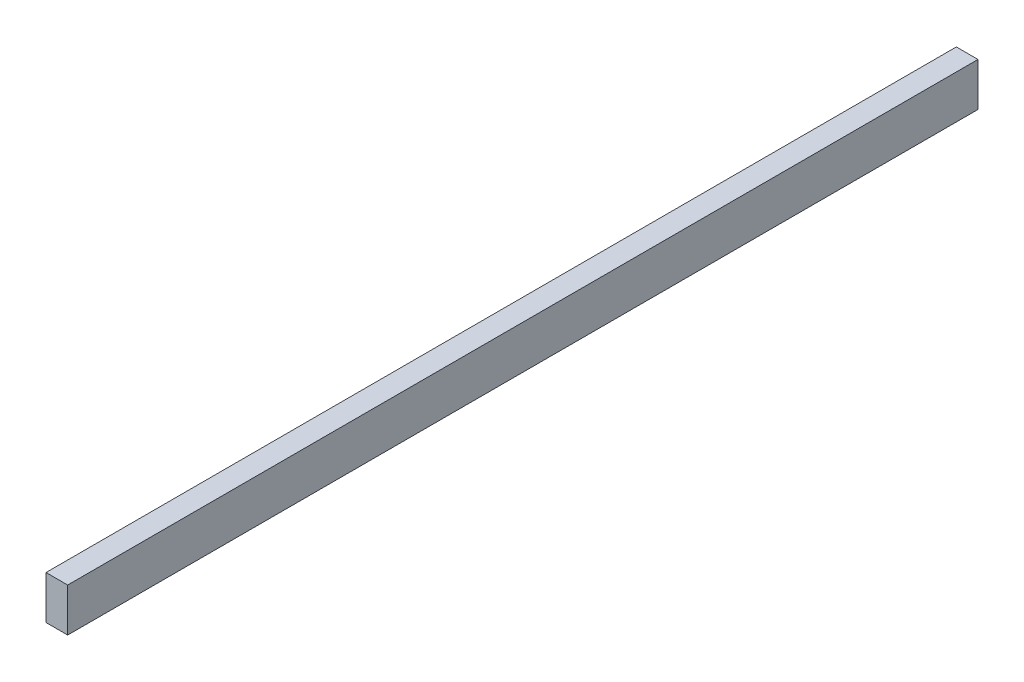
ISO-10303-21;
HEADER;
FILE_DESCRIPTION(('STEP AP214'),'2;1');
FILE_NAME('part.step','',(''),(''),'','','');
FILE_SCHEMA(('AUTOMOTIVE_DESIGN { 1 0 10303 214 1 1 1 1 }'));
ENDSEC;
DATA;
#1=APPLICATION_CONTEXT('core data for automotive mechanical design processes');
#2=APPLICATION_PROTOCOL_DEFINITION('international standard','automotive_design',2000,#1);
#3=PRODUCT_CONTEXT('',#1,'mechanical');
#4=PRODUCT('Part','Part','',(#3));
#5=PRODUCT_RELATED_PRODUCT_CATEGORY('part','',(#4));
#6=PRODUCT_DEFINITION_FORMATION('','',#4);
#7=PRODUCT_DEFINITION_CONTEXT('part definition',#1,'design');
#8=PRODUCT_DEFINITION('design','',#6,#7);
#9=PRODUCT_DEFINITION_SHAPE('','',#8);
#10=(LENGTH_UNIT() NAMED_UNIT(*) SI_UNIT(.MILLI.,.METRE.));
#11=(NAMED_UNIT(*) PLANE_ANGLE_UNIT() SI_UNIT($,.RADIAN.));
#12=(NAMED_UNIT(*) SI_UNIT($,.STERADIAN.) SOLID_ANGLE_UNIT());
#13=UNCERTAINTY_MEASURE_WITH_UNIT(LENGTH_MEASURE(1.E-05),#10,'distance_accuracy_value','');
#14=(GEOMETRIC_REPRESENTATION_CONTEXT(3) GLOBAL_UNCERTAINTY_ASSIGNED_CONTEXT((#13)) GLOBAL_UNIT_ASSIGNED_CONTEXT((#10,
#11,#12)) REPRESENTATION_CONTEXT('',''));
#15=CARTESIAN_POINT('',(0.,0.,0.));
#16=DIRECTION('',(0.,0.,1.));
#17=DIRECTION('',(1.,0.,0.));
#18=AXIS2_PLACEMENT_3D('',#15,#16,#17);
#19=CARTESIAN_POINT('',(-12.7,25.4,1066.8));
#20=DIRECTION('',(1.,0.,0.));
#21=DIRECTION('',(0.,1.,0.));
#22=AXIS2_PLACEMENT_3D('',#19,#20,#21);
#23=PLANE('',#22);
#24=DIRECTION('',(0.,-1.,0.));
#25=VECTOR('',#24,1.);
#26=CARTESIAN_POINT('',(-12.7,25.4,0.));
#27=LINE('',#26,#25);
#28=CARTESIAN_POINT('',(-12.7,25.4,0.));
#29=VERTEX_POINT('',#28);
#30=CARTESIAN_POINT('',(-12.7,-25.4,0.));
#31=VERTEX_POINT('',#30);
#32=EDGE_CURVE('E106',#29,#31,#27,.T.);
#33=ORIENTED_EDGE('',*,*,#32,.T.);
#34=DIRECTION('',(0.,0.,-1.));
#35=VECTOR('',#34,1.);
#36=CARTESIAN_POINT('',(-12.7,-25.4,1066.8));
#37=LINE('',#36,#35);
#38=CARTESIAN_POINT('',(-12.7,-25.4,1066.8));
#39=VERTEX_POINT('',#38);
#40=EDGE_CURVE('E11',#39,#31,#37,.T.);
#41=ORIENTED_EDGE('',*,*,#40,.F.);
#42=DIRECTION('',(0.,-1.,0.));
#43=VECTOR('',#42,1.);
#44=CARTESIAN_POINT('',(-12.7,25.4,1066.8));
#45=LINE('',#44,#43);
#46=CARTESIAN_POINT('',(-12.7,25.4,1066.8));
#47=VERTEX_POINT('',#46);
#48=EDGE_CURVE('E94',#47,#39,#45,.T.);
#49=ORIENTED_EDGE('',*,*,#48,.F.);
#50=DIRECTION('',(0.,0.,-1.));
#51=VECTOR('',#50,1.);
#52=CARTESIAN_POINT('',(-12.7,25.4,1066.8));
#53=LINE('',#52,#51);
#54=EDGE_CURVE('E102',#47,#29,#53,.T.);
#55=ORIENTED_EDGE('',*,*,#54,.T.);
#56=EDGE_LOOP('',(#33,#41,#49,#55));
#57=FACE_BOUND('',#56,.T.);
#58=ADVANCED_FACE('F43',(#57),#23,.F.);
#59=CARTESIAN_POINT('',(-12.7,-25.4,1066.8));
#60=DIRECTION('',(0.,1.,0.));
#61=DIRECTION('',(0.,0.,1.));
#62=AXIS2_PLACEMENT_3D('',#59,#60,#61);
#63=PLANE('',#62);
#64=DIRECTION('',(1.,0.,0.));
#65=VECTOR('',#64,1.);
#66=CARTESIAN_POINT('',(-12.7,-25.4,0.));
#67=LINE('',#66,#65);
#68=CARTESIAN_POINT('',(12.7,-25.4,0.));
#69=VERTEX_POINT('',#68);
#70=EDGE_CURVE('E98',#31,#69,#67,.T.);
#71=ORIENTED_EDGE('',*,*,#70,.T.);
#72=DIRECTION('',(0.,0.,-1.));
#73=VECTOR('',#72,1.);
#74=CARTESIAN_POINT('',(12.7,-25.4,1066.8));
#75=LINE('',#74,#73);
#76=CARTESIAN_POINT('',(12.7,-25.4,1066.8));
#77=VERTEX_POINT('',#76);
#78=EDGE_CURVE('E51',#77,#69,#75,.T.);
#79=ORIENTED_EDGE('',*,*,#78,.F.);
#80=DIRECTION('',(1.,0.,0.));
#81=VECTOR('',#80,1.);
#82=CARTESIAN_POINT('',(-12.7,-25.4,1066.8));
#83=LINE('',#82,#81);
#84=EDGE_CURVE('E89',#39,#77,#83,.T.);
#85=ORIENTED_EDGE('',*,*,#84,.F.);
#86=ORIENTED_EDGE('',*,*,#40,.T.);
#87=EDGE_LOOP('',(#71,#79,#85,#86));
#88=FACE_BOUND('',#87,.T.);
#89=ADVANCED_FACE('F97',(#88),#63,.F.);
#90=CARTESIAN_POINT('',(12.7,25.4,1066.8));
#91=DIRECTION('',(-1.,0.,0.));
#92=DIRECTION('',(0.,-1.,0.));
#93=AXIS2_PLACEMENT_3D('',#90,#91,#92);
#94=PLANE('',#93);
#95=DIRECTION('',(0.,1.,0.));
#96=VECTOR('',#95,1.);
#97=CARTESIAN_POINT('',(12.7,25.4,0.));
#98=LINE('',#97,#96);
#99=CARTESIAN_POINT('',(12.7,25.4,0.));
#100=VERTEX_POINT('',#99);
#101=EDGE_CURVE('E76',#69,#100,#98,.T.);
#102=ORIENTED_EDGE('',*,*,#101,.T.);
#103=DIRECTION('',(0.,0.,-1.));
#104=VECTOR('',#103,1.);
#105=CARTESIAN_POINT('',(12.7,25.4,1066.8));
#106=LINE('',#105,#104);
#107=CARTESIAN_POINT('',(12.7,25.4,1066.8));
#108=VERTEX_POINT('',#107);
#109=EDGE_CURVE('E99',#108,#100,#106,.T.);
#110=ORIENTED_EDGE('',*,*,#109,.F.);
#111=DIRECTION('',(0.,1.,0.));
#112=VECTOR('',#111,1.);
#113=CARTESIAN_POINT('',(12.7,25.4,1066.8));
#114=LINE('',#113,#112);
#115=EDGE_CURVE('E92',#77,#108,#114,.T.);
#116=ORIENTED_EDGE('',*,*,#115,.F.);
#117=ORIENTED_EDGE('',*,*,#78,.T.);
#118=EDGE_LOOP('',(#102,#110,#116,#117));
#119=FACE_BOUND('',#118,.T.);
#120=ADVANCED_FACE('F100',(#119),#94,.F.);
#121=CARTESIAN_POINT('',(-12.7,25.4,1066.8));
#122=DIRECTION('',(0.,-1.,0.));
#123=DIRECTION('',(0.,0.,-1.));
#124=AXIS2_PLACEMENT_3D('',#121,#122,#123);
#125=PLANE('',#124);
#126=DIRECTION('',(-1.,0.,0.));
#127=VECTOR('',#126,1.);
#128=CARTESIAN_POINT('',(-12.7,25.4,0.));
#129=LINE('',#128,#127);
#130=EDGE_CURVE('E82',#100,#29,#129,.T.);
#131=ORIENTED_EDGE('',*,*,#130,.T.);
#132=ORIENTED_EDGE('',*,*,#54,.F.);
#133=DIRECTION('',(-1.,0.,0.));
#134=VECTOR('',#133,1.);
#135=CARTESIAN_POINT('',(-12.7,25.4,1066.8));
#136=LINE('',#135,#134);
#137=EDGE_CURVE('E59',#108,#47,#136,.T.);
#138=ORIENTED_EDGE('',*,*,#137,.F.);
#139=ORIENTED_EDGE('',*,*,#109,.T.);
#140=EDGE_LOOP('',(#131,#132,#138,#139));
#141=FACE_BOUND('',#140,.T.);
#142=ADVANCED_FACE('F113',(#141),#125,.F.);
#143=CARTESIAN_POINT('',(0.,0.,1066.8));
#144=DIRECTION('',(0.,0.,1.));
#145=DIRECTION('',(1.,0.,0.));
#146=AXIS2_PLACEMENT_3D('',#143,#144,#145);
#147=PLANE('',#146);
#148=ORIENTED_EDGE('',*,*,#48,.T.);
#149=ORIENTED_EDGE('',*,*,#84,.T.);
#150=ORIENTED_EDGE('',*,*,#115,.T.);
#151=ORIENTED_EDGE('',*,*,#137,.T.);
#152=EDGE_LOOP('',(#148,#149,#150,#151));
#153=FACE_BOUND('',#152,.T.);
#154=ADVANCED_FACE('F90',(#153),#147,.T.);
#155=CARTESIAN_POINT('',(0.,0.,0.));
#156=DIRECTION('',(0.,0.,1.));
#157=DIRECTION('',(1.,0.,0.));
#158=AXIS2_PLACEMENT_3D('',#155,#156,#157);
#159=PLANE('',#158);
#160=ORIENTED_EDGE('',*,*,#32,.F.);
#161=ORIENTED_EDGE('',*,*,#130,.F.);
#162=ORIENTED_EDGE('',*,*,#101,.F.);
#163=ORIENTED_EDGE('',*,*,#70,.F.);
#164=EDGE_LOOP('',(#160,#161,#162,#163));
#165=FACE_BOUND('',#164,.T.);
#166=ADVANCED_FACE('F116',(#165),#159,.F.);
#167=CLOSED_SHELL('',(#58,#89,#120,#142,#154,#166));
#168=MANIFOLD_SOLID_BREP('B2',#167);
#169=ADVANCED_BREP_SHAPE_REPRESENTATION('',(#18,#168),#14);
#170=SHAPE_DEFINITION_REPRESENTATION(#9,#169);
ENDSEC;
END-ISO-10303-21;
